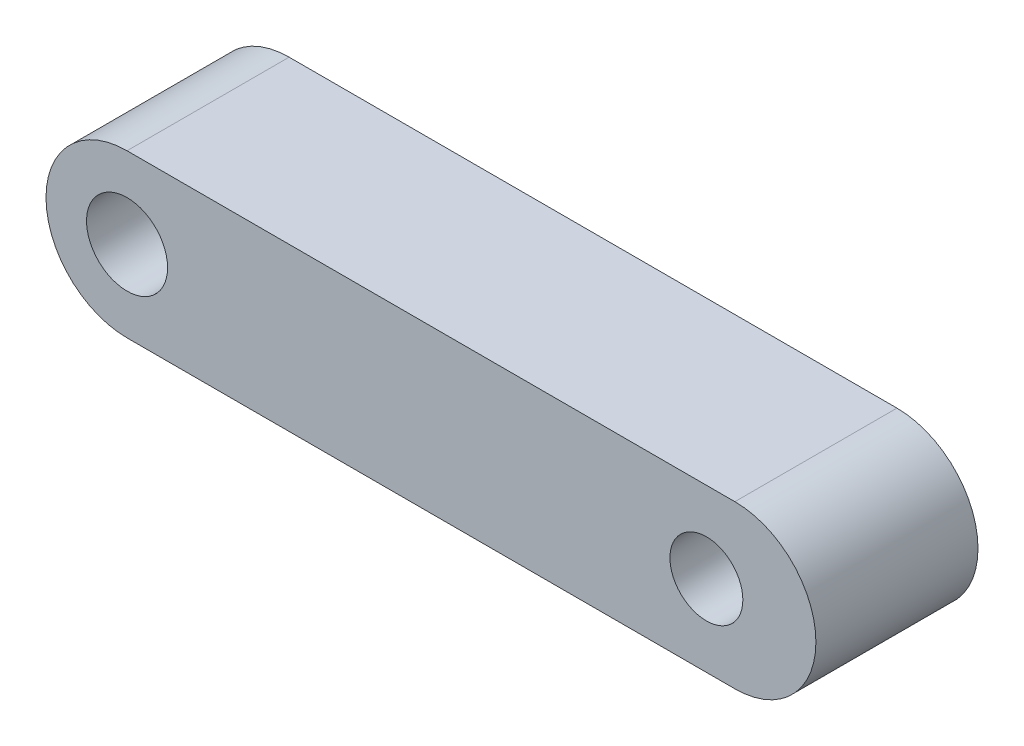
ISO-10303-21;
HEADER;
FILE_DESCRIPTION(('STEP AP214'),'2;1');
FILE_NAME('part.step','',(''),(''),'','','');
FILE_SCHEMA(('AUTOMOTIVE_DESIGN { 1 0 10303 214 1 1 1 1 }'));
ENDSEC;
DATA;
#1=APPLICATION_CONTEXT('core data for automotive mechanical design processes');
#2=APPLICATION_PROTOCOL_DEFINITION('international standard','automotive_design',2000,#1);
#3=PRODUCT_CONTEXT('',#1,'mechanical');
#4=PRODUCT('Part','Part','',(#3));
#5=PRODUCT_RELATED_PRODUCT_CATEGORY('part','',(#4));
#6=PRODUCT_DEFINITION_FORMATION('','',#4);
#7=PRODUCT_DEFINITION_CONTEXT('part definition',#1,'design');
#8=PRODUCT_DEFINITION('design','',#6,#7);
#9=PRODUCT_DEFINITION_SHAPE('','',#8);
#10=(LENGTH_UNIT() NAMED_UNIT(*) SI_UNIT(.MILLI.,.METRE.));
#11=(NAMED_UNIT(*) PLANE_ANGLE_UNIT() SI_UNIT($,.RADIAN.));
#12=(NAMED_UNIT(*) SI_UNIT($,.STERADIAN.) SOLID_ANGLE_UNIT());
#13=UNCERTAINTY_MEASURE_WITH_UNIT(LENGTH_MEASURE(1.E-05),#10,'distance_accuracy_value','');
#14=(GEOMETRIC_REPRESENTATION_CONTEXT(3) GLOBAL_UNCERTAINTY_ASSIGNED_CONTEXT((#13)) GLOBAL_UNIT_ASSIGNED_CONTEXT((#10,
#11,#12)) REPRESENTATION_CONTEXT('',''));
#15=CARTESIAN_POINT('',(0.,0.,0.));
#16=DIRECTION('',(0.,0.,1.));
#17=DIRECTION('',(1.,0.,0.));
#18=AXIS2_PLACEMENT_3D('',#15,#16,#17);
#19=CARTESIAN_POINT('',(-15.1360867795607,0.,4.));
#20=DIRECTION('',(0.,0.,-1.));
#21=DIRECTION('',(-1.,0.,0.));
#22=AXIS2_PLACEMENT_3D('',#19,#20,#21);
#23=CYLINDRICAL_SURFACE('',#22,2.);
#24=CARTESIAN_POINT('',(-15.1360867795607,0.,0.));
#25=DIRECTION('',(0.,0.,1.));
#26=DIRECTION('',(1.,0.,0.));
#27=AXIS2_PLACEMENT_3D('',#24,#25,#26);
#28=CIRCLE('',#27,2.);
#29=CARTESIAN_POINT('',(-15.1360867795607,2.,0.));
#30=VERTEX_POINT('',#29);
#31=CARTESIAN_POINT('',(-15.1360867795607,-2.,0.));
#32=VERTEX_POINT('',#31);
#33=EDGE_CURVE('E104',#30,#32,#28,.T.);
#34=ORIENTED_EDGE('',*,*,#33,.T.);
#35=DIRECTION('',(0.,0.,-1.));
#36=VECTOR('',#35,1.);
#37=CARTESIAN_POINT('',(-15.1360867795607,-2.,4.));
#38=LINE('',#37,#36);
#39=CARTESIAN_POINT('',(-15.1360867795607,-2.,4.));
#40=VERTEX_POINT('',#39);
#41=EDGE_CURVE('E11',#40,#32,#38,.T.);
#42=ORIENTED_EDGE('',*,*,#41,.F.);
#43=CARTESIAN_POINT('',(-15.1360867795607,0.,4.));
#44=DIRECTION('',(0.,0.,1.));
#45=DIRECTION('',(1.,0.,0.));
#46=AXIS2_PLACEMENT_3D('',#43,#44,#45);
#47=CIRCLE('',#46,2.);
#48=CARTESIAN_POINT('',(-15.1360867795607,2.,4.));
#49=VERTEX_POINT('',#48);
#50=EDGE_CURVE('E92',#49,#40,#47,.T.);
#51=ORIENTED_EDGE('',*,*,#50,.F.);
#52=DIRECTION('',(0.,0.,-1.));
#53=VECTOR('',#52,1.);
#54=CARTESIAN_POINT('',(-15.1360867795607,2.,4.));
#55=LINE('',#54,#53);
#56=EDGE_CURVE('E100',#49,#30,#55,.T.);
#57=ORIENTED_EDGE('',*,*,#56,.T.);
#58=EDGE_LOOP('',(#34,#42,#51,#57));
#59=FACE_BOUND('',#58,.T.);
#60=ADVANCED_FACE('F41',(#59),#23,.T.);
#61=CARTESIAN_POINT('',(-15.1360867795607,-2.,4.));
#62=DIRECTION('',(0.,1.,0.));
#63=DIRECTION('',(0.,0.,1.));
#64=AXIS2_PLACEMENT_3D('',#61,#62,#63);
#65=PLANE('',#64);
#66=DIRECTION('',(1.,0.,0.));
#67=VECTOR('',#66,1.);
#68=CARTESIAN_POINT('',(-15.1360867795607,-2.,0.));
#69=LINE('',#68,#67);
#70=CARTESIAN_POINT('',(-0.136086779560716,-2.,0.));
#71=VERTEX_POINT('',#70);
#72=EDGE_CURVE('E96',#32,#71,#69,.T.);
#73=ORIENTED_EDGE('',*,*,#72,.T.);
#74=DIRECTION('',(0.,0.,-1.));
#75=VECTOR('',#74,1.);
#76=CARTESIAN_POINT('',(-0.136086779560716,-2.,4.));
#77=LINE('',#76,#75);
#78=CARTESIAN_POINT('',(-0.136086779560716,-2.,4.));
#79=VERTEX_POINT('',#78);
#80=EDGE_CURVE('E49',#79,#71,#77,.T.);
#81=ORIENTED_EDGE('',*,*,#80,.F.);
#82=DIRECTION('',(1.,0.,0.));
#83=VECTOR('',#82,1.);
#84=CARTESIAN_POINT('',(-15.1360867795607,-2.,4.));
#85=LINE('',#84,#83);
#86=EDGE_CURVE('E87',#40,#79,#85,.T.);
#87=ORIENTED_EDGE('',*,*,#86,.F.);
#88=ORIENTED_EDGE('',*,*,#41,.T.);
#89=EDGE_LOOP('',(#73,#81,#87,#88));
#90=FACE_BOUND('',#89,.T.);
#91=ADVANCED_FACE('F95',(#90),#65,.F.);
#92=CARTESIAN_POINT('',(-0.136086779560715,0.,4.));
#93=DIRECTION('',(0.,0.,-1.));
#94=DIRECTION('',(-1.,0.,0.));
#95=AXIS2_PLACEMENT_3D('',#92,#93,#94);
#96=CYLINDRICAL_SURFACE('',#95,2.);
#97=CARTESIAN_POINT('',(-0.136086779560715,0.,0.));
#98=DIRECTION('',(0.,0.,1.));
#99=DIRECTION('',(1.,0.,0.));
#100=AXIS2_PLACEMENT_3D('',#97,#98,#99);
#101=CIRCLE('',#100,2.);
#102=CARTESIAN_POINT('',(-0.136086779560715,2.,0.));
#103=VERTEX_POINT('',#102);
#104=EDGE_CURVE('E74',#71,#103,#101,.T.);
#105=ORIENTED_EDGE('',*,*,#104,.T.);
#106=DIRECTION('',(0.,0.,-1.));
#107=VECTOR('',#106,1.);
#108=CARTESIAN_POINT('',(-0.136086779560715,2.,4.));
#109=LINE('',#108,#107);
#110=CARTESIAN_POINT('',(-0.136086779560715,2.,4.));
#111=VERTEX_POINT('',#110);
#112=EDGE_CURVE('E97',#111,#103,#109,.T.);
#113=ORIENTED_EDGE('',*,*,#112,.F.);
#114=CARTESIAN_POINT('',(-0.136086779560715,0.,4.));
#115=DIRECTION('',(0.,0.,1.));
#116=DIRECTION('',(1.,0.,0.));
#117=AXIS2_PLACEMENT_3D('',#114,#115,#116);
#118=CIRCLE('',#117,2.);
#119=EDGE_CURVE('E90',#79,#111,#118,.T.);
#120=ORIENTED_EDGE('',*,*,#119,.F.);
#121=ORIENTED_EDGE('',*,*,#80,.T.);
#122=EDGE_LOOP('',(#105,#113,#120,#121));
#123=FACE_BOUND('',#122,.T.);
#124=ADVANCED_FACE('F98',(#123),#96,.T.);
#125=CARTESIAN_POINT('',(-15.1360867795607,2.,4.));
#126=DIRECTION('',(0.,-1.,0.));
#127=DIRECTION('',(0.,0.,-1.));
#128=AXIS2_PLACEMENT_3D('',#125,#126,#127);
#129=PLANE('',#128);
#130=DIRECTION('',(-1.,0.,0.));
#131=VECTOR('',#130,1.);
#132=CARTESIAN_POINT('',(-15.1360867795607,2.,0.));
#133=LINE('',#132,#131);
#134=EDGE_CURVE('E80',#103,#30,#133,.T.);
#135=ORIENTED_EDGE('',*,*,#134,.T.);
#136=ORIENTED_EDGE('',*,*,#56,.F.);
#137=DIRECTION('',(-1.,0.,0.));
#138=VECTOR('',#137,1.);
#139=CARTESIAN_POINT('',(-15.1360867795607,2.,4.));
#140=LINE('',#139,#138);
#141=EDGE_CURVE('E57',#111,#49,#140,.T.);
#142=ORIENTED_EDGE('',*,*,#141,.F.);
#143=ORIENTED_EDGE('',*,*,#112,.T.);
#144=EDGE_LOOP('',(#135,#136,#142,#143));
#145=FACE_BOUND('',#144,.T.);
#146=ADVANCED_FACE('F112',(#145),#129,.F.);
#147=CARTESIAN_POINT('',(-15.1360867795607,0.,4.));
#148=DIRECTION('',(0.,0.,1.));
#149=DIRECTION('',(1.,0.,0.));
#150=AXIS2_PLACEMENT_3D('',#147,#148,#149);
#151=PLANE('',#150);
#152=CARTESIAN_POINT('',(-15.1360867795607,0.,4.));
#153=DIRECTION('',(0.,0.,1.));
#154=DIRECTION('',(1.,0.,0.));
#155=AXIS2_PLACEMENT_3D('',#152,#153,#154);
#156=CIRCLE('',#155,1.);
#157=CARTESIAN_POINT('',(-14.1360867795607,0.,4.));
#158=VERTEX_POINT('',#157);
#159=EDGE_CURVE('E124',#158,#158,#156,.T.);
#160=ORIENTED_EDGE('',*,*,#159,.F.);
#161=EDGE_LOOP('',(#160));
#162=FACE_BOUND('',#161,.T.);
#163=CARTESIAN_POINT('',(-0.839109338334625,0.,4.));
#164=DIRECTION('',(0.,0.,1.));
#165=DIRECTION('',(1.,0.,0.));
#166=AXIS2_PLACEMENT_3D('',#163,#164,#165);
#167=CIRCLE('',#166,0.9);
#168=CARTESIAN_POINT('',(0.0608906616653747,0.,4.));
#169=VERTEX_POINT('',#168);
#170=EDGE_CURVE('E121',#169,#169,#167,.T.);
#171=ORIENTED_EDGE('',*,*,#170,.F.);
#172=EDGE_LOOP('',(#171));
#173=FACE_BOUND('',#172,.T.);
#174=ORIENTED_EDGE('',*,*,#50,.T.);
#175=ORIENTED_EDGE('',*,*,#86,.T.);
#176=ORIENTED_EDGE('',*,*,#119,.T.);
#177=ORIENTED_EDGE('',*,*,#141,.T.);
#178=EDGE_LOOP('',(#174,#175,#176,#177));
#179=FACE_BOUND('',#178,.T.);
#180=ADVANCED_FACE('F88',(#162,#173,#179),#151,.T.);
#181=CARTESIAN_POINT('',(-15.1360867795607,0.,0.));
#182=DIRECTION('',(0.,0.,1.));
#183=DIRECTION('',(1.,0.,0.));
#184=AXIS2_PLACEMENT_3D('',#181,#182,#183);
#185=PLANE('',#184);
#186=CARTESIAN_POINT('',(-15.1360867795607,0.,0.));
#187=DIRECTION('',(0.,0.,1.));
#188=DIRECTION('',(1.,0.,0.));
#189=AXIS2_PLACEMENT_3D('',#186,#187,#188);
#190=CIRCLE('',#189,1.);
#191=CARTESIAN_POINT('',(-14.1360867795607,0.,0.));
#192=VERTEX_POINT('',#191);
#193=EDGE_CURVE('E107',#192,#192,#190,.T.);
#194=ORIENTED_EDGE('',*,*,#193,.T.);
#195=EDGE_LOOP('',(#194));
#196=FACE_BOUND('',#195,.T.);
#197=CARTESIAN_POINT('',(-0.839109338334625,0.,0.));
#198=DIRECTION('',(0.,0.,1.));
#199=DIRECTION('',(1.,0.,0.));
#200=AXIS2_PLACEMENT_3D('',#197,#198,#199);
#201=CIRCLE('',#200,0.9);
#202=CARTESIAN_POINT('',(0.0608906616653747,0.,0.));
#203=VERTEX_POINT('',#202);
#204=EDGE_CURVE('E118',#203,#203,#201,.T.);
#205=ORIENTED_EDGE('',*,*,#204,.T.);
#206=EDGE_LOOP('',(#205));
#207=FACE_BOUND('',#206,.T.);
#208=ORIENTED_EDGE('',*,*,#33,.F.);
#209=ORIENTED_EDGE('',*,*,#134,.F.);
#210=ORIENTED_EDGE('',*,*,#104,.F.);
#211=ORIENTED_EDGE('',*,*,#72,.F.);
#212=EDGE_LOOP('',(#208,#209,#210,#211));
#213=FACE_BOUND('',#212,.T.);
#214=ADVANCED_FACE('F115',(#196,#207,#213),#185,.F.);
#215=CARTESIAN_POINT('',(-0.839109338334625,0.,0.));
#216=DIRECTION('',(0.,0.,1.));
#217=DIRECTION('',(1.,0.,0.));
#218=AXIS2_PLACEMENT_3D('',#215,#216,#217);
#219=CYLINDRICAL_SURFACE('',#218,0.9);
#220=ORIENTED_EDGE('',*,*,#204,.F.);
#221=EDGE_LOOP('',(#220));
#222=FACE_BOUND('',#221,.T.);
#223=ORIENTED_EDGE('',*,*,#170,.T.);
#224=EDGE_LOOP('',(#223));
#225=FACE_BOUND('',#224,.T.);
#226=ADVANCED_FACE('F135',(#222,#225),#219,.F.);
#227=CARTESIAN_POINT('',(-15.1360867795607,0.,0.));
#228=DIRECTION('',(0.,0.,1.));
#229=DIRECTION('',(1.,0.,0.));
#230=AXIS2_PLACEMENT_3D('',#227,#228,#229);
#231=CYLINDRICAL_SURFACE('',#230,1.);
#232=ORIENTED_EDGE('',*,*,#193,.F.);
#233=EDGE_LOOP('',(#232));
#234=FACE_BOUND('',#233,.T.);
#235=ORIENTED_EDGE('',*,*,#159,.T.);
#236=EDGE_LOOP('',(#235));
#237=FACE_BOUND('',#236,.T.);
#238=ADVANCED_FACE('F132',(#234,#237),#231,.F.);
#239=CLOSED_SHELL('',(#60,#91,#124,#146,#180,#214,#226,#238));
#240=MANIFOLD_SOLID_BREP('B2',#239);
#241=ADVANCED_BREP_SHAPE_REPRESENTATION('',(#18,#240),#14);
#242=SHAPE_DEFINITION_REPRESENTATION(#9,#241);
ENDSEC;
END-ISO-10303-21;
